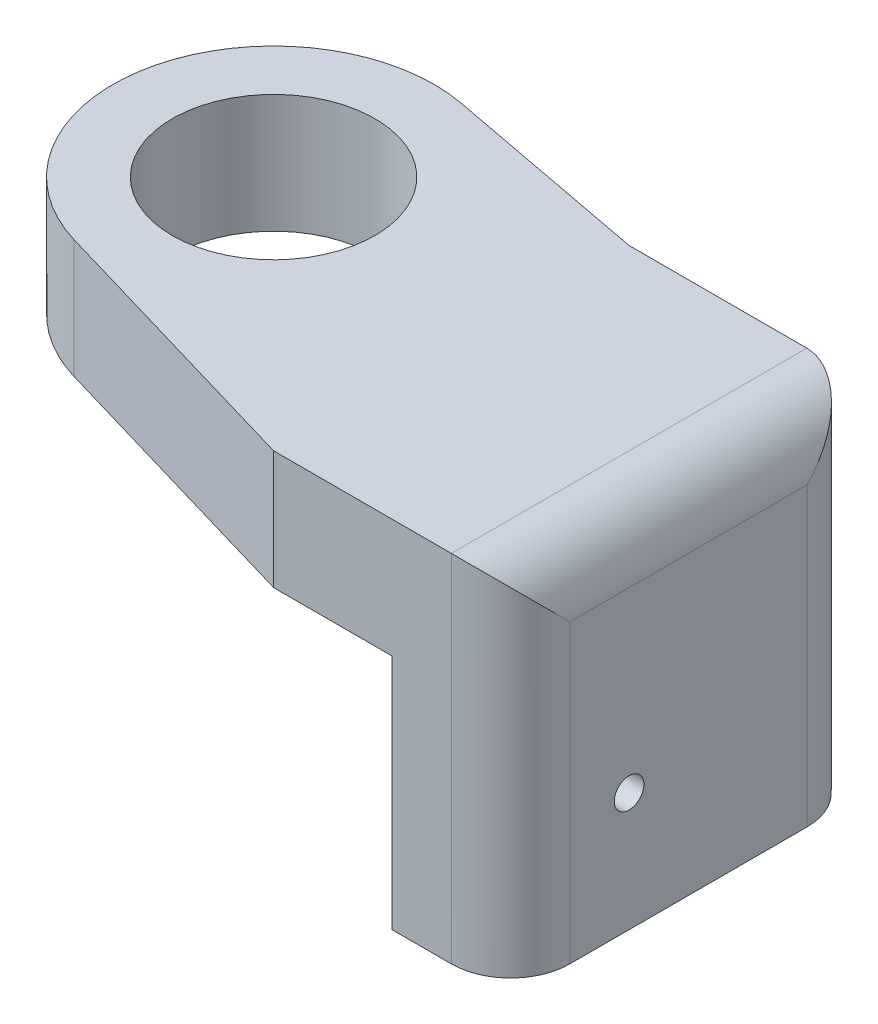
ISO-10303-21;
HEADER;
FILE_DESCRIPTION(('STEP AP214'),'2;1');
FILE_NAME('part.step','',(''),(''),'','','');
FILE_SCHEMA(('AUTOMOTIVE_DESIGN { 1 0 10303 214 1 1 1 1 }'));
ENDSEC;
DATA;
#1=APPLICATION_CONTEXT('core data for automotive mechanical design processes');
#2=APPLICATION_PROTOCOL_DEFINITION('international standard','automotive_design',2000,#1);
#3=PRODUCT_CONTEXT('',#1,'mechanical');
#4=PRODUCT('Part','Part','',(#3));
#5=PRODUCT_RELATED_PRODUCT_CATEGORY('part','',(#4));
#6=PRODUCT_DEFINITION_FORMATION('','',#4);
#7=PRODUCT_DEFINITION_CONTEXT('part definition',#1,'design');
#8=PRODUCT_DEFINITION('design','',#6,#7);
#9=PRODUCT_DEFINITION_SHAPE('','',#8);
#10=(LENGTH_UNIT() NAMED_UNIT(*) SI_UNIT(.MILLI.,.METRE.));
#11=(NAMED_UNIT(*) PLANE_ANGLE_UNIT() SI_UNIT($,.RADIAN.));
#12=(NAMED_UNIT(*) SI_UNIT($,.STERADIAN.) SOLID_ANGLE_UNIT());
#13=UNCERTAINTY_MEASURE_WITH_UNIT(LENGTH_MEASURE(1.E-05),#10,'distance_accuracy_value','');
#14=(GEOMETRIC_REPRESENTATION_CONTEXT(3) GLOBAL_UNCERTAINTY_ASSIGNED_CONTEXT((#13)) GLOBAL_UNIT_ASSIGNED_CONTEXT((#10,
#11,#12)) REPRESENTATION_CONTEXT('',''));
#15=CARTESIAN_POINT('',(0.,0.,0.));
#16=DIRECTION('',(0.,0.,1.));
#17=DIRECTION('',(1.,0.,0.));
#18=AXIS2_PLACEMENT_3D('',#15,#16,#17);
#19=CARTESIAN_POINT('',(0.,10.,30.));
#20=DIRECTION('',(0.,0.,-1.));
#21=DIRECTION('',(-1.,0.,0.));
#22=AXIS2_PLACEMENT_3D('',#19,#20,#21);
#23=PLANE('',#22);
#24=DIRECTION('',(-1.,0.,0.));
#25=VECTOR('',#24,1.);
#26=CARTESIAN_POINT('',(20.,-20.,30.));
#27=LINE('',#26,#25);
#28=CARTESIAN_POINT('',(15.,-20.,30.));
#29=VERTEX_POINT('',#28);
#30=CARTESIAN_POINT('',(10.,-20.,30.));
#31=VERTEX_POINT('',#30);
#32=EDGE_CURVE('E166',#29,#31,#27,.T.);
#33=ORIENTED_EDGE('',*,*,#32,.F.);
#34=DIRECTION('',(0.,-1.,0.));
#35=VECTOR('',#34,1.);
#36=CARTESIAN_POINT('',(15.,10.,30.));
#37=LINE('',#36,#35);
#38=CARTESIAN_POINT('',(15.,10.,30.));
#39=VERTEX_POINT('',#38);
#40=EDGE_CURVE('E64',#29,#39,#37,.F.);
#41=ORIENTED_EDGE('',*,*,#40,.T.);
#42=DIRECTION('',(1.,0.,0.));
#43=VECTOR('',#42,1.);
#44=CARTESIAN_POINT('',(0.,10.,30.));
#45=LINE('',#44,#43);
#46=CARTESIAN_POINT('',(0.,10.,30.));
#47=VERTEX_POINT('',#46);
#48=EDGE_CURVE('E234',#47,#39,#45,.T.);
#49=ORIENTED_EDGE('',*,*,#48,.F.);
#50=DIRECTION('',(0.,-1.,0.));
#51=VECTOR('',#50,1.);
#52=CARTESIAN_POINT('',(0.,10.,30.));
#53=LINE('',#52,#51);
#54=CARTESIAN_POINT('',(0.,0.,30.));
#55=VERTEX_POINT('',#54);
#56=EDGE_CURVE('E237',#47,#55,#53,.T.);
#57=ORIENTED_EDGE('',*,*,#56,.T.);
#58=DIRECTION('',(1.,0.,0.));
#59=VECTOR('',#58,1.);
#60=CARTESIAN_POINT('',(0.,0.,30.));
#61=LINE('',#60,#59);
#62=CARTESIAN_POINT('',(10.,0.,30.));
#63=VERTEX_POINT('',#62);
#64=EDGE_CURVE('E233',#55,#63,#61,.T.);
#65=ORIENTED_EDGE('',*,*,#64,.T.);
#66=DIRECTION('',(0.,1.,0.));
#67=VECTOR('',#66,1.);
#68=CARTESIAN_POINT('',(10.,-10.,30.));
#69=LINE('',#68,#67);
#70=EDGE_CURVE('E192',#31,#63,#69,.T.);
#71=ORIENTED_EDGE('',*,*,#70,.F.);
#72=EDGE_LOOP('',(#33,#41,#49,#57,#65,#71));
#73=FACE_BOUND('',#72,.T.);
#74=ADVANCED_FACE('F39',(#73),#23,.F.);
#75=CARTESIAN_POINT('',(20.,10.,0.));
#76=DIRECTION('',(-1.,0.,0.));
#77=DIRECTION('',(0.,0.,1.));
#78=AXIS2_PLACEMENT_3D('',#75,#76,#77);
#79=PLANE('',#78);
#80=CARTESIAN_POINT('',(20.,-10.,20.));
#81=DIRECTION('',(-1.,0.,0.));
#82=DIRECTION('',(0.,0.,1.));
#83=AXIS2_PLACEMENT_3D('',#80,#81,#82);
#84=CIRCLE('',#83,1.25);
#85=CARTESIAN_POINT('',(20.,-10.,21.25));
#86=VERTEX_POINT('',#85);
#87=EDGE_CURVE('E156',#86,#86,#84,.F.);
#88=ORIENTED_EDGE('',*,*,#87,.F.);
#89=EDGE_LOOP('',(#88));
#90=FACE_BOUND('',#89,.T.);
#91=DIRECTION('',(0.,0.,1.));
#92=VECTOR('',#91,1.);
#93=CARTESIAN_POINT('',(20.,5.,30.));
#94=LINE('',#93,#92);
#95=CARTESIAN_POINT('',(20.,5.,5.));
#96=VERTEX_POINT('',#95);
#97=CARTESIAN_POINT('',(20.,5.,25.));
#98=VERTEX_POINT('',#97);
#99=EDGE_CURVE('E247',#96,#98,#94,.T.);
#100=ORIENTED_EDGE('',*,*,#99,.T.);
#101=DIRECTION('',(0.,-1.,0.));
#102=VECTOR('',#101,1.);
#103=CARTESIAN_POINT('',(20.,10.,25.));
#104=LINE('',#103,#102);
#105=CARTESIAN_POINT('',(20.,-20.,25.));
#106=VERTEX_POINT('',#105);
#107=EDGE_CURVE('E250',#98,#106,#104,.T.);
#108=ORIENTED_EDGE('',*,*,#107,.T.);
#109=DIRECTION('',(0.,0.,1.));
#110=VECTOR('',#109,1.);
#111=CARTESIAN_POINT('',(20.,-20.,0.));
#112=LINE('',#111,#110);
#113=CARTESIAN_POINT('',(20.,-20.,5.));
#114=VERTEX_POINT('',#113);
#115=EDGE_CURVE('E147',#114,#106,#112,.T.);
#116=ORIENTED_EDGE('',*,*,#115,.F.);
#117=DIRECTION('',(0.,-1.,0.));
#118=VECTOR('',#117,1.);
#119=CARTESIAN_POINT('',(20.,10.,5.));
#120=LINE('',#119,#118);
#121=EDGE_CURVE('E244',#114,#96,#120,.F.);
#122=ORIENTED_EDGE('',*,*,#121,.T.);
#123=EDGE_LOOP('',(#100,#108,#116,#122));
#124=FACE_BOUND('',#123,.T.);
#125=ADVANCED_FACE('F301',(#90,#124),#79,.F.);
#126=CARTESIAN_POINT('',(0.,10.,0.));
#127=DIRECTION('',(0.,0.,1.));
#128=DIRECTION('',(1.,0.,0.));
#129=AXIS2_PLACEMENT_3D('',#126,#127,#128);
#130=PLANE('',#129);
#131=DIRECTION('',(1.,0.,0.));
#132=VECTOR('',#131,1.);
#133=CARTESIAN_POINT('',(20.,10.,0.));
#134=LINE('',#133,#132);
#135=CARTESIAN_POINT('',(0.,10.,0.));
#136=VERTEX_POINT('',#135);
#137=CARTESIAN_POINT('',(15.,10.,0.));
#138=VERTEX_POINT('',#137);
#139=EDGE_CURVE('E174',#136,#138,#134,.T.);
#140=ORIENTED_EDGE('',*,*,#139,.T.);
#141=DIRECTION('',(0.,-1.,0.));
#142=VECTOR('',#141,1.);
#143=CARTESIAN_POINT('',(15.,10.,0.));
#144=LINE('',#143,#142);
#145=CARTESIAN_POINT('',(15.,-20.,0.));
#146=VERTEX_POINT('',#145);
#147=EDGE_CURVE('E11',#138,#146,#144,.T.);
#148=ORIENTED_EDGE('',*,*,#147,.T.);
#149=DIRECTION('',(1.,0.,0.));
#150=VECTOR('',#149,1.);
#151=CARTESIAN_POINT('',(0.,-20.,0.));
#152=LINE('',#151,#150);
#153=CARTESIAN_POINT('',(0.,-20.,0.));
#154=VERTEX_POINT('',#153);
#155=EDGE_CURVE('E141',#154,#146,#152,.T.);
#156=ORIENTED_EDGE('',*,*,#155,.F.);
#157=DIRECTION('',(0.,1.,0.));
#158=VECTOR('',#157,1.);
#159=CARTESIAN_POINT('',(0.,-10.,0.));
#160=LINE('',#159,#158);
#161=CARTESIAN_POINT('',(0.,0.,0.));
#162=VERTEX_POINT('',#161);
#163=EDGE_CURVE('E127',#154,#162,#160,.T.);
#164=ORIENTED_EDGE('',*,*,#163,.T.);
#165=DIRECTION('',(0.,1.,0.));
#166=VECTOR('',#165,1.);
#167=CARTESIAN_POINT('',(0.,-47.4468650176173,0.));
#168=LINE('',#167,#166);
#169=EDGE_CURVE('E222',#162,#136,#168,.T.);
#170=ORIENTED_EDGE('',*,*,#169,.T.);
#171=EDGE_LOOP('',(#140,#148,#156,#164,#170));
#172=FACE_BOUND('',#171,.T.);
#173=ADVANCED_FACE('F142',(#172),#130,.F.);
#174=CARTESIAN_POINT('',(0.,10.,0.));
#175=DIRECTION('',(0.,1.,0.));
#176=DIRECTION('',(0.,0.,1.));
#177=AXIS2_PLACEMENT_3D('',#174,#175,#176);
#178=PLANE('',#177);
#179=ORIENTED_EDGE('',*,*,#48,.T.);
#180=DIRECTION('',(0.,0.,1.));
#181=VECTOR('',#180,1.);
#182=CARTESIAN_POINT('',(15.,10.,0.));
#183=LINE('',#182,#181);
#184=EDGE_CURVE('E49',#39,#138,#183,.F.);
#185=ORIENTED_EDGE('',*,*,#184,.T.);
#186=ORIENTED_EDGE('',*,*,#139,.F.);
#187=DIRECTION('',(-0.982503193400875,0.,-0.186245738091056));
#188=VECTOR('',#187,1.);
#189=CARTESIAN_POINT('',(0.,10.,0.));
#190=LINE('',#189,#188);
#191=CARTESIAN_POINT('',(-17.5137222803635,10.,-3.31994456072693));
#192=VERTEX_POINT('',#191);
#193=EDGE_CURVE('E210',#136,#192,#190,.T.);
#194=ORIENTED_EDGE('',*,*,#193,.T.);
#195=CARTESIAN_POINT('',(-20.,10.,10.));
#196=DIRECTION('',(0.,1.,0.));
#197=DIRECTION('',(0.,0.,1.));
#198=AXIS2_PLACEMENT_3D('',#195,#196,#197);
#199=CIRCLE('',#198,13.55);
#200=CARTESIAN_POINT('',(-23.8463627019932,10.,22.9926130537593));
#201=VERTEX_POINT('',#200);
#202=EDGE_CURVE('E214',#192,#201,#199,.T.);
#203=ORIENTED_EDGE('',*,*,#202,.T.);
#204=DIRECTION('',(0.959433535309962,0.,0.281934906179829));
#205=VECTOR('',#204,1.);
#206=CARTESIAN_POINT('',(0.,10.,30.));
#207=LINE('',#206,#205);
#208=EDGE_CURVE('E218',#201,#47,#207,.T.);
#209=ORIENTED_EDGE('',*,*,#208,.T.);
#210=EDGE_LOOP('',(#179,#185,#186,#194,#203,#209));
#211=FACE_BOUND('',#210,.T.);
#212=CARTESIAN_POINT('',(-20.,10.,10.));
#213=DIRECTION('',(0.,1.,0.));
#214=DIRECTION('',(0.,0.,1.));
#215=AXIS2_PLACEMENT_3D('',#212,#213,#214);
#216=CIRCLE('',#215,8.55);
#217=CARTESIAN_POINT('',(-20.,10.,18.55));
#218=VERTEX_POINT('',#217);
#219=EDGE_CURVE('E195',#218,#218,#216,.T.);
#220=ORIENTED_EDGE('',*,*,#219,.F.);
#221=EDGE_LOOP('',(#220));
#222=FACE_BOUND('',#221,.T.);
#223=ADVANCED_FACE('F338',(#211,#222),#178,.T.);
#224=CARTESIAN_POINT('',(0.,0.,0.));
#225=DIRECTION('',(0.,1.,0.));
#226=DIRECTION('',(0.,0.,1.));
#227=AXIS2_PLACEMENT_3D('',#224,#225,#226);
#228=PLANE('',#227);
#229=DIRECTION('',(0.982503193400875,0.,0.186245738091056));
#230=VECTOR('',#229,1.);
#231=CARTESIAN_POINT('',(0.,0.,0.));
#232=LINE('',#231,#230);
#233=CARTESIAN_POINT('',(-17.5137222803635,0.,-3.31994456072693));
#234=VERTEX_POINT('',#233);
#235=EDGE_CURVE('E196',#234,#162,#232,.T.);
#236=ORIENTED_EDGE('',*,*,#235,.T.);
#237=DIRECTION('',(0.,0.,1.));
#238=VECTOR('',#237,1.);
#239=CARTESIAN_POINT('',(0.,0.,0.));
#240=LINE('',#239,#238);
#241=CARTESIAN_POINT('',(0.,0.,10.));
#242=VERTEX_POINT('',#241);
#243=EDGE_CURVE('E133',#162,#242,#240,.T.);
#244=ORIENTED_EDGE('',*,*,#243,.T.);
#245=DIRECTION('',(1.,0.,0.));
#246=VECTOR('',#245,1.);
#247=CARTESIAN_POINT('',(0.,0.,10.));
#248=LINE('',#247,#246);
#249=CARTESIAN_POINT('',(10.,0.,10.));
#250=VERTEX_POINT('',#249);
#251=EDGE_CURVE('E181',#242,#250,#248,.T.);
#252=ORIENTED_EDGE('',*,*,#251,.T.);
#253=DIRECTION('',(0.,0.,1.));
#254=VECTOR('',#253,1.);
#255=CARTESIAN_POINT('',(10.,0.,10.));
#256=LINE('',#255,#254);
#257=EDGE_CURVE('E177',#250,#63,#256,.T.);
#258=ORIENTED_EDGE('',*,*,#257,.T.);
#259=ORIENTED_EDGE('',*,*,#64,.F.);
#260=DIRECTION('',(-0.959433535309962,0.,-0.281934906179829));
#261=VECTOR('',#260,1.);
#262=CARTESIAN_POINT('',(0.,0.,30.));
#263=LINE('',#262,#261);
#264=CARTESIAN_POINT('',(-23.8463627019932,0.,22.9926130537593));
#265=VERTEX_POINT('',#264);
#266=EDGE_CURVE('E200',#55,#265,#263,.T.);
#267=ORIENTED_EDGE('',*,*,#266,.T.);
#268=CARTESIAN_POINT('',(-20.,0.,10.));
#269=DIRECTION('',(0.,1.,0.));
#270=DIRECTION('',(0.,0.,1.));
#271=AXIS2_PLACEMENT_3D('',#268,#269,#270);
#272=CIRCLE('',#271,13.55);
#273=EDGE_CURVE('E201',#265,#234,#272,.F.);
#274=ORIENTED_EDGE('',*,*,#273,.T.);
#275=EDGE_LOOP('',(#236,#244,#252,#258,#259,#267,#274));
#276=FACE_BOUND('',#275,.T.);
#277=CARTESIAN_POINT('',(-20.,0.,10.));
#278=DIRECTION('',(0.,1.,0.));
#279=DIRECTION('',(0.,0.,1.));
#280=AXIS2_PLACEMENT_3D('',#277,#278,#279);
#281=CIRCLE('',#280,8.55);
#282=CARTESIAN_POINT('',(-20.,0.,18.55));
#283=VERTEX_POINT('',#282);
#284=EDGE_CURVE('E199',#283,#283,#281,.F.);
#285=ORIENTED_EDGE('',*,*,#284,.F.);
#286=EDGE_LOOP('',(#285));
#287=FACE_BOUND('',#286,.T.);
#288=ADVANCED_FACE('F291',(#276,#287),#228,.F.);
#289=CARTESIAN_POINT('',(0.,-47.4468650176173,0.));
#290=DIRECTION('',(0.186245738091056,0.,-0.982503193400875));
#291=DIRECTION('',(-0.982503193400875,0.,-0.186245738091056));
#292=AXIS2_PLACEMENT_3D('',#289,#290,#291);
#293=PLANE('',#292);
#294=ORIENTED_EDGE('',*,*,#235,.F.);
#295=DIRECTION('',(0.,1.,0.));
#296=VECTOR('',#295,1.);
#297=CARTESIAN_POINT('',(-17.5137222803635,-47.4468650176173,-3.31994456072693));
#298=LINE('',#297,#296);
#299=EDGE_CURVE('E225',#234,#192,#298,.T.);
#300=ORIENTED_EDGE('',*,*,#299,.T.);
#301=ORIENTED_EDGE('',*,*,#193,.F.);
#302=ORIENTED_EDGE('',*,*,#169,.F.);
#303=EDGE_LOOP('',(#294,#300,#301,#302));
#304=FACE_BOUND('',#303,.T.);
#305=ADVANCED_FACE('F343',(#304),#293,.T.);
#306=CARTESIAN_POINT('',(-20.,-47.4468650176173,10.));
#307=DIRECTION('',(0.,1.,0.));
#308=DIRECTION('',(0.,0.,1.));
#309=AXIS2_PLACEMENT_3D('',#306,#307,#308);
#310=CYLINDRICAL_SURFACE('',#309,13.55);
#311=ORIENTED_EDGE('',*,*,#273,.F.);
#312=DIRECTION('',(0.,1.,0.));
#313=VECTOR('',#312,1.);
#314=CARTESIAN_POINT('',(-23.8463627019932,-47.4468650176173,22.9926130537593));
#315=LINE('',#314,#313);
#316=EDGE_CURVE('E204',#265,#201,#315,.T.);
#317=ORIENTED_EDGE('',*,*,#316,.T.);
#318=ORIENTED_EDGE('',*,*,#202,.F.);
#319=ORIENTED_EDGE('',*,*,#299,.F.);
#320=EDGE_LOOP('',(#311,#317,#318,#319));
#321=FACE_BOUND('',#320,.T.);
#322=ADVANCED_FACE('F333',(#321),#310,.T.);
#323=CARTESIAN_POINT('',(0.,-47.4468650176173,30.));
#324=DIRECTION('',(-0.281934906179829,0.,0.959433535309962));
#325=DIRECTION('',(0.959433535309962,0.,0.281934906179829));
#326=AXIS2_PLACEMENT_3D('',#323,#324,#325);
#327=PLANE('',#326);
#328=ORIENTED_EDGE('',*,*,#266,.F.);
#329=ORIENTED_EDGE('',*,*,#56,.F.);
#330=ORIENTED_EDGE('',*,*,#208,.F.);
#331=ORIENTED_EDGE('',*,*,#316,.F.);
#332=EDGE_LOOP('',(#328,#329,#330,#331));
#333=FACE_BOUND('',#332,.T.);
#334=ADVANCED_FACE('F337',(#333),#327,.T.);
#335=CARTESIAN_POINT('',(-20.,-47.4468650176173,10.));
#336=DIRECTION('',(0.,1.,0.));
#337=DIRECTION('',(0.,0.,1.));
#338=AXIS2_PLACEMENT_3D('',#335,#336,#337);
#339=CYLINDRICAL_SURFACE('',#338,8.55);
#340=ORIENTED_EDGE('',*,*,#284,.T.);
#341=EDGE_LOOP('',(#340));
#342=FACE_BOUND('',#341,.T.);
#343=ORIENTED_EDGE('',*,*,#219,.T.);
#344=EDGE_LOOP('',(#343));
#345=FACE_BOUND('',#344,.T.);
#346=ADVANCED_FACE('F284',(#342,#345),#339,.F.);
#347=CARTESIAN_POINT('',(10.,-10.,10.));
#348=DIRECTION('',(-1.,0.,0.));
#349=DIRECTION('',(0.,0.,1.));
#350=AXIS2_PLACEMENT_3D('',#347,#348,#349);
#351=PLANE('',#350);
#352=CARTESIAN_POINT('',(10.,-10.,20.));
#353=DIRECTION('',(-1.,0.,0.));
#354=DIRECTION('',(0.,0.,1.));
#355=AXIS2_PLACEMENT_3D('',#352,#353,#354);
#356=CIRCLE('',#355,1.25);
#357=CARTESIAN_POINT('',(10.,-10.,21.25));
#358=VERTEX_POINT('',#357);
#359=EDGE_CURVE('E160',#358,#358,#356,.T.);
#360=ORIENTED_EDGE('',*,*,#359,.F.);
#361=EDGE_LOOP('',(#360));
#362=FACE_BOUND('',#361,.T.);
#363=ORIENTED_EDGE('',*,*,#257,.F.);
#364=DIRECTION('',(0.,1.,0.));
#365=VECTOR('',#364,1.);
#366=CARTESIAN_POINT('',(10.,-10.,10.));
#367=LINE('',#366,#365);
#368=CARTESIAN_POINT('',(10.,-20.,10.));
#369=VERTEX_POINT('',#368);
#370=EDGE_CURVE('E189',#369,#250,#367,.T.);
#371=ORIENTED_EDGE('',*,*,#370,.F.);
#372=DIRECTION('',(0.,0.,-1.));
#373=VECTOR('',#372,1.);
#374=CARTESIAN_POINT('',(10.,-20.,30.));
#375=LINE('',#374,#373);
#376=EDGE_CURVE('E169',#31,#369,#375,.T.);
#377=ORIENTED_EDGE('',*,*,#376,.F.);
#378=ORIENTED_EDGE('',*,*,#70,.T.);
#379=EDGE_LOOP('',(#363,#371,#377,#378));
#380=FACE_BOUND('',#379,.T.);
#381=ADVANCED_FACE('F280',(#362,#380),#351,.T.);
#382=CARTESIAN_POINT('',(0.,-10.,10.));
#383=DIRECTION('',(0.,0.,1.));
#384=DIRECTION('',(1.,0.,0.));
#385=AXIS2_PLACEMENT_3D('',#382,#383,#384);
#386=PLANE('',#385);
#387=ORIENTED_EDGE('',*,*,#251,.F.);
#388=DIRECTION('',(0.,1.,0.));
#389=VECTOR('',#388,1.);
#390=CARTESIAN_POINT('',(0.,-10.,10.));
#391=LINE('',#390,#389);
#392=CARTESIAN_POINT('',(0.,-20.,10.));
#393=VERTEX_POINT('',#392);
#394=EDGE_CURVE('E138',#393,#242,#391,.T.);
#395=ORIENTED_EDGE('',*,*,#394,.F.);
#396=DIRECTION('',(-1.,0.,0.));
#397=VECTOR('',#396,1.);
#398=CARTESIAN_POINT('',(10.,-20.,10.));
#399=LINE('',#398,#397);
#400=EDGE_CURVE('E154',#369,#393,#399,.T.);
#401=ORIENTED_EDGE('',*,*,#400,.F.);
#402=ORIENTED_EDGE('',*,*,#370,.T.);
#403=EDGE_LOOP('',(#387,#395,#401,#402));
#404=FACE_BOUND('',#403,.T.);
#405=ADVANCED_FACE('F283',(#404),#386,.T.);
#406=CARTESIAN_POINT('',(0.,-10.,0.));
#407=DIRECTION('',(-1.,0.,0.));
#408=DIRECTION('',(0.,0.,1.));
#409=AXIS2_PLACEMENT_3D('',#406,#407,#408);
#410=PLANE('',#409);
#411=ORIENTED_EDGE('',*,*,#243,.F.);
#412=ORIENTED_EDGE('',*,*,#163,.F.);
#413=DIRECTION('',(0.,0.,-1.));
#414=VECTOR('',#413,1.);
#415=CARTESIAN_POINT('',(0.,-20.,10.));
#416=LINE('',#415,#414);
#417=EDGE_CURVE('E131',#393,#154,#416,.T.);
#418=ORIENTED_EDGE('',*,*,#417,.F.);
#419=ORIENTED_EDGE('',*,*,#394,.T.);
#420=EDGE_LOOP('',(#411,#412,#418,#419));
#421=FACE_BOUND('',#420,.T.);
#422=ADVANCED_FACE('F129',(#421),#410,.T.);
#423=CARTESIAN_POINT('',(0.,-20.,0.));
#424=DIRECTION('',(0.,-1.,0.));
#425=DIRECTION('',(0.,0.,-1.));
#426=AXIS2_PLACEMENT_3D('',#423,#424,#425);
#427=PLANE('',#426);
#428=ORIENTED_EDGE('',*,*,#115,.T.);
#429=CARTESIAN_POINT('',(15.,-20.,25.));
#430=DIRECTION('',(0.,-1.,0.));
#431=DIRECTION('',(0.,0.,-1.));
#432=AXIS2_PLACEMENT_3D('',#429,#430,#431);
#433=CIRCLE('',#432,5.);
#434=EDGE_CURVE('E257',#106,#29,#433,.T.);
#435=ORIENTED_EDGE('',*,*,#434,.T.);
#436=ORIENTED_EDGE('',*,*,#32,.T.);
#437=ORIENTED_EDGE('',*,*,#376,.T.);
#438=ORIENTED_EDGE('',*,*,#400,.T.);
#439=ORIENTED_EDGE('',*,*,#417,.T.);
#440=ORIENTED_EDGE('',*,*,#155,.T.);
#441=CARTESIAN_POINT('',(15.,-20.,5.));
#442=DIRECTION('',(0.,-1.,0.));
#443=DIRECTION('',(0.,0.,-1.));
#444=AXIS2_PLACEMENT_3D('',#441,#442,#443);
#445=CIRCLE('',#444,5.);
#446=EDGE_CURVE('E254',#146,#114,#445,.T.);
#447=ORIENTED_EDGE('',*,*,#446,.T.);
#448=EDGE_LOOP('',(#428,#435,#436,#437,#438,#439,#440,#447));
#449=FACE_BOUND('',#448,.T.);
#450=ADVANCED_FACE('F151',(#449),#427,.T.);
#451=CARTESIAN_POINT('',(23.5355339059327,-10.,20.));
#452=DIRECTION('',(-1.,0.,0.));
#453=DIRECTION('',(0.,0.,1.));
#454=AXIS2_PLACEMENT_3D('',#451,#452,#453);
#455=CYLINDRICAL_SURFACE('',#454,1.25);
#456=ORIENTED_EDGE('',*,*,#87,.T.);
#457=EDGE_LOOP('',(#456));
#458=FACE_BOUND('',#457,.T.);
#459=ORIENTED_EDGE('',*,*,#359,.T.);
#460=EDGE_LOOP('',(#459));
#461=FACE_BOUND('',#460,.T.);
#462=ADVANCED_FACE('F278',(#458,#461),#455,.F.);
#463=CARTESIAN_POINT('',(15.,10.,5.));
#464=DIRECTION('',(0.,-1.,0.));
#465=DIRECTION('',(0.,0.,-1.));
#466=AXIS2_PLACEMENT_3D('',#463,#464,#465);
#467=CYLINDRICAL_SURFACE('',#466,5.);
#468=ORIENTED_EDGE('',*,*,#446,.F.);
#469=ORIENTED_EDGE('',*,*,#147,.F.);
#470=CARTESIAN_POINT('',(15.,5.,5.));
#471=DIRECTION('',(0.,-0.707106781186547,-0.707106781186547));
#472=DIRECTION('',(0.,-0.707106781186547,0.707106781186547));
#473=AXIS2_PLACEMENT_3D('',#470,#471,#472);
#474=ELLIPSE('',#473,7.07106781186547,5.);
#475=EDGE_CURVE('E43',#96,#138,#474,.F.);
#476=ORIENTED_EDGE('',*,*,#475,.F.);
#477=ORIENTED_EDGE('',*,*,#121,.F.);
#478=EDGE_LOOP('',(#468,#469,#476,#477));
#479=FACE_BOUND('',#478,.T.);
#480=ADVANCED_FACE('F41',(#479),#467,.T.);
#481=CARTESIAN_POINT('',(15.,5.,0.));
#482=DIRECTION('',(0.,0.,-1.));
#483=DIRECTION('',(-1.,0.,0.));
#484=AXIS2_PLACEMENT_3D('',#481,#482,#483);
#485=CYLINDRICAL_SURFACE('',#484,5.);
#486=ORIENTED_EDGE('',*,*,#475,.T.);
#487=ORIENTED_EDGE('',*,*,#184,.F.);
#488=CARTESIAN_POINT('',(15.,5.,25.));
#489=DIRECTION('',(0.,0.707106781186547,-0.707106781186547));
#490=DIRECTION('',(0.,-0.707106781186547,-0.707106781186547));
#491=AXIS2_PLACEMENT_3D('',#488,#489,#490);
#492=ELLIPSE('',#491,7.07106781186547,5.);
#493=EDGE_CURVE('E263',#98,#39,#492,.F.);
#494=ORIENTED_EDGE('',*,*,#493,.F.);
#495=ORIENTED_EDGE('',*,*,#99,.F.);
#496=EDGE_LOOP('',(#486,#487,#494,#495));
#497=FACE_BOUND('',#496,.T.);
#498=ADVANCED_FACE('F312',(#497),#485,.T.);
#499=CARTESIAN_POINT('',(15.,10.,25.));
#500=DIRECTION('',(0.,-1.,0.));
#501=DIRECTION('',(0.,0.,-1.));
#502=AXIS2_PLACEMENT_3D('',#499,#500,#501);
#503=CYLINDRICAL_SURFACE('',#502,5.);
#504=ORIENTED_EDGE('',*,*,#493,.T.);
#505=ORIENTED_EDGE('',*,*,#40,.F.);
#506=ORIENTED_EDGE('',*,*,#434,.F.);
#507=ORIENTED_EDGE('',*,*,#107,.F.);
#508=EDGE_LOOP('',(#504,#505,#506,#507));
#509=FACE_BOUND('',#508,.T.);
#510=ADVANCED_FACE('F310',(#509),#503,.T.);
#511=CLOSED_SHELL('',(#74,#125,#173,#223,#288,#305,#322,#334,#346,#381,#405,#422,#450,#462,#480,
#498,#510));
#512=MANIFOLD_SOLID_BREP('B2',#511);
#513=ADVANCED_BREP_SHAPE_REPRESENTATION('',(#18,#512),#14);
#514=SHAPE_DEFINITION_REPRESENTATION(#9,#513);
ENDSEC;
END-ISO-10303-21;
